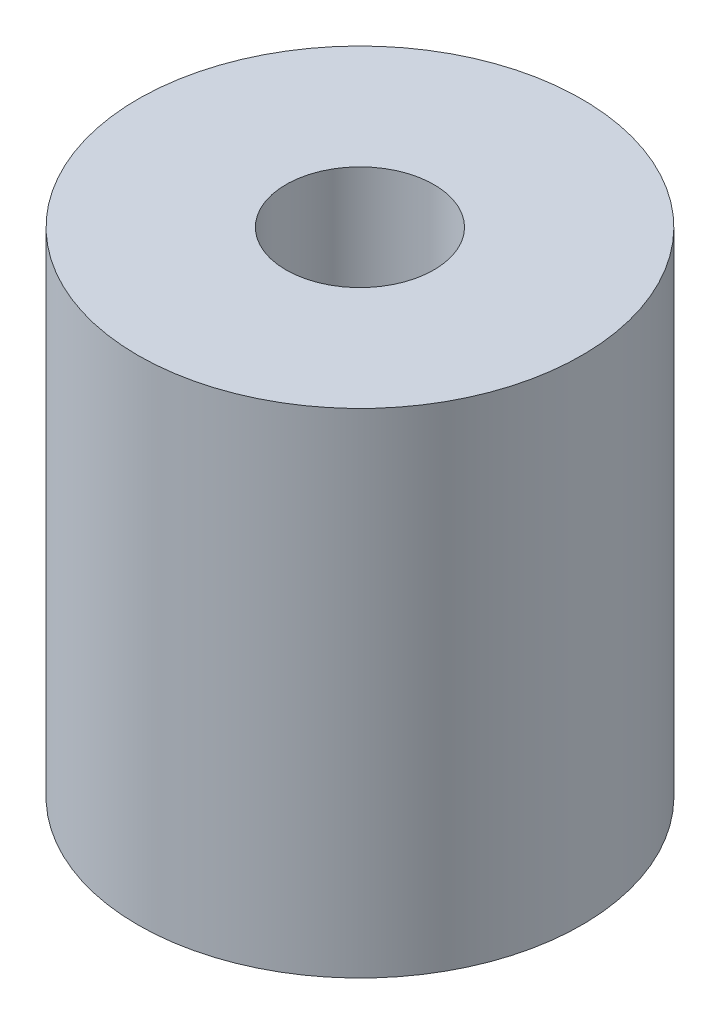
ISO-10303-21;
HEADER;
FILE_DESCRIPTION(('STEP AP214'),'2;1');
FILE_NAME('part.step','',(''),(''),'','','');
FILE_SCHEMA(('AUTOMOTIVE_DESIGN { 1 0 10303 214 1 1 1 1 }'));
ENDSEC;
DATA;
#1=APPLICATION_CONTEXT('core data for automotive mechanical design processes');
#2=APPLICATION_PROTOCOL_DEFINITION('international standard','automotive_design',2000,#1);
#3=PRODUCT_CONTEXT('',#1,'mechanical');
#4=PRODUCT('Part','Part','',(#3));
#5=PRODUCT_RELATED_PRODUCT_CATEGORY('part','',(#4));
#6=PRODUCT_DEFINITION_FORMATION('','',#4);
#7=PRODUCT_DEFINITION_CONTEXT('part definition',#1,'design');
#8=PRODUCT_DEFINITION('design','',#6,#7);
#9=PRODUCT_DEFINITION_SHAPE('','',#8);
#10=(LENGTH_UNIT() NAMED_UNIT(*) SI_UNIT(.MILLI.,.METRE.));
#11=(NAMED_UNIT(*) PLANE_ANGLE_UNIT() SI_UNIT($,.RADIAN.));
#12=(NAMED_UNIT(*) SI_UNIT($,.STERADIAN.) SOLID_ANGLE_UNIT());
#13=UNCERTAINTY_MEASURE_WITH_UNIT(LENGTH_MEASURE(1.E-05),#10,'distance_accuracy_value','');
#14=(GEOMETRIC_REPRESENTATION_CONTEXT(3) GLOBAL_UNCERTAINTY_ASSIGNED_CONTEXT((#13)) GLOBAL_UNIT_ASSIGNED_CONTEXT((#10,
#11,#12)) REPRESENTATION_CONTEXT('',''));
#15=CARTESIAN_POINT('',(0.,0.,0.));
#16=DIRECTION('',(0.,0.,1.));
#17=DIRECTION('',(1.,0.,0.));
#18=AXIS2_PLACEMENT_3D('',#15,#16,#17);
#19=CARTESIAN_POINT('',(0.,10.,0.));
#20=DIRECTION('',(0.,1.,0.));
#21=DIRECTION('',(0.,0.,1.));
#22=AXIS2_PLACEMENT_3D('',#19,#20,#21);
#23=PLANE('',#22);
#24=CARTESIAN_POINT('',(0.,10.,0.));
#25=DIRECTION('',(0.,1.,0.));
#26=DIRECTION('',(0.,0.,1.));
#27=AXIS2_PLACEMENT_3D('',#24,#25,#26);
#28=CIRCLE('',#27,4.5);
#29=CARTESIAN_POINT('',(0.,10.,4.5));
#30=VERTEX_POINT('',#29);
#31=EDGE_CURVE('E10',#30,#30,#28,.T.);
#32=ORIENTED_EDGE('',*,*,#31,.T.);
#33=EDGE_LOOP('',(#32));
#34=FACE_BOUND('',#33,.T.);
#35=CARTESIAN_POINT('',(0.,10.,0.));
#36=DIRECTION('',(0.,1.,0.));
#37=DIRECTION('',(0.,0.,1.));
#38=AXIS2_PLACEMENT_3D('',#35,#36,#37);
#39=CIRCLE('',#38,1.5);
#40=CARTESIAN_POINT('',(0.,10.,1.5));
#41=VERTEX_POINT('',#40);
#42=EDGE_CURVE('E39',#41,#41,#39,.T.);
#43=ORIENTED_EDGE('',*,*,#42,.F.);
#44=EDGE_LOOP('',(#43));
#45=FACE_BOUND('',#44,.T.);
#46=ADVANCED_FACE('F28',(#34,#45),#23,.T.);
#47=CARTESIAN_POINT('',(0.,0.,0.));
#48=DIRECTION('',(0.,1.,0.));
#49=DIRECTION('',(0.,0.,1.));
#50=AXIS2_PLACEMENT_3D('',#47,#48,#49);
#51=PLANE('',#50);
#52=CARTESIAN_POINT('',(0.,0.,0.));
#53=DIRECTION('',(0.,1.,0.));
#54=DIRECTION('',(0.,0.,1.));
#55=AXIS2_PLACEMENT_3D('',#52,#53,#54);
#56=CIRCLE('',#55,4.5);
#57=CARTESIAN_POINT('',(0.,0.,4.5));
#58=VERTEX_POINT('',#57);
#59=EDGE_CURVE('E32',#58,#58,#56,.T.);
#60=ORIENTED_EDGE('',*,*,#59,.F.);
#61=EDGE_LOOP('',(#60));
#62=FACE_BOUND('',#61,.T.);
#63=CARTESIAN_POINT('',(0.,0.,0.));
#64=DIRECTION('',(0.,1.,0.));
#65=DIRECTION('',(0.,0.,1.));
#66=AXIS2_PLACEMENT_3D('',#63,#64,#65);
#67=CIRCLE('',#66,1.5);
#68=CARTESIAN_POINT('',(0.,0.,1.5));
#69=VERTEX_POINT('',#68);
#70=EDGE_CURVE('E41',#69,#69,#67,.T.);
#71=ORIENTED_EDGE('',*,*,#70,.T.);
#72=EDGE_LOOP('',(#71));
#73=FACE_BOUND('',#72,.T.);
#74=ADVANCED_FACE('F51',(#62,#73),#51,.F.);
#75=CARTESIAN_POINT('',(0.,10.,0.));
#76=DIRECTION('',(0.,-1.,0.));
#77=DIRECTION('',(0.,0.,-1.));
#78=AXIS2_PLACEMENT_3D('',#75,#76,#77);
#79=CYLINDRICAL_SURFACE('',#78,4.5);
#80=ORIENTED_EDGE('',*,*,#31,.F.);
#81=EDGE_LOOP('',(#80));
#82=FACE_BOUND('',#81,.T.);
#83=ORIENTED_EDGE('',*,*,#59,.T.);
#84=EDGE_LOOP('',(#83));
#85=FACE_BOUND('',#84,.T.);
#86=ADVANCED_FACE('F30',(#82,#85),#79,.T.);
#87=CARTESIAN_POINT('',(0.,10.,0.));
#88=DIRECTION('',(0.,-1.,0.));
#89=DIRECTION('',(0.,0.,-1.));
#90=AXIS2_PLACEMENT_3D('',#87,#88,#89);
#91=CYLINDRICAL_SURFACE('',#90,1.5);
#92=ORIENTED_EDGE('',*,*,#42,.T.);
#93=EDGE_LOOP('',(#92));
#94=FACE_BOUND('',#93,.T.);
#95=ORIENTED_EDGE('',*,*,#70,.F.);
#96=EDGE_LOOP('',(#95));
#97=FACE_BOUND('',#96,.T.);
#98=ADVANCED_FACE('F47',(#94,#97),#91,.F.);
#99=CLOSED_SHELL('',(#46,#74,#86,#98));
#100=MANIFOLD_SOLID_BREP('B2',#99);
#101=ADVANCED_BREP_SHAPE_REPRESENTATION('',(#18,#100),#14);
#102=SHAPE_DEFINITION_REPRESENTATION(#9,#101);
ENDSEC;
END-ISO-10303-21;
